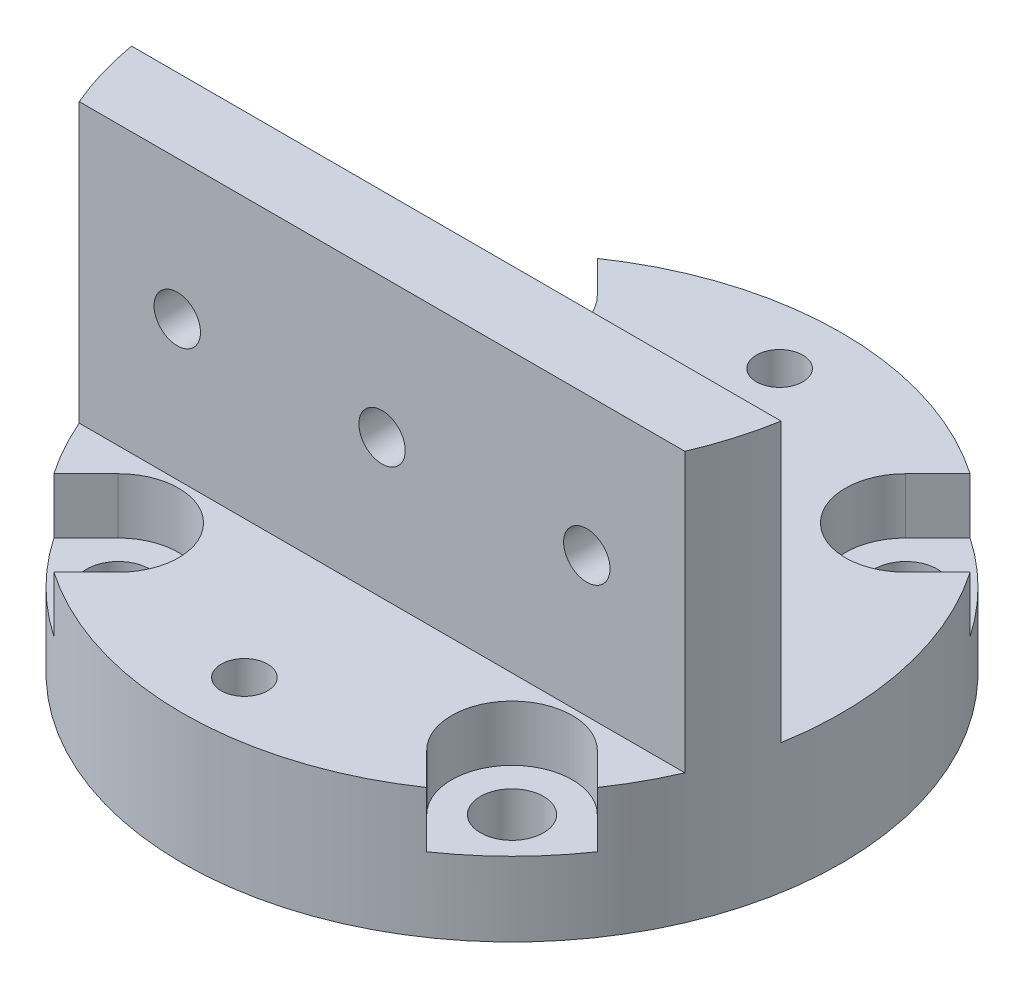
ISO-10303-21;
HEADER;
FILE_DESCRIPTION(('STEP AP214'),'2;1');
FILE_NAME('part.step','',(''),(''),'','','');
FILE_SCHEMA(('AUTOMOTIVE_DESIGN { 1 0 10303 214 1 1 1 1 }'));
ENDSEC;
DATA;
#1=APPLICATION_CONTEXT('core data for automotive mechanical design processes');
#2=APPLICATION_PROTOCOL_DEFINITION('international standard','automotive_design',2000,#1);
#3=PRODUCT_CONTEXT('',#1,'mechanical');
#4=PRODUCT('Part','Part','',(#3));
#5=PRODUCT_RELATED_PRODUCT_CATEGORY('part','',(#4));
#6=PRODUCT_DEFINITION_FORMATION('','',#4);
#7=PRODUCT_DEFINITION_CONTEXT('part definition',#1,'design');
#8=PRODUCT_DEFINITION('design','',#6,#7);
#9=PRODUCT_DEFINITION_SHAPE('','',#8);
#10=(LENGTH_UNIT() NAMED_UNIT(*) SI_UNIT(.MILLI.,.METRE.));
#11=(NAMED_UNIT(*) PLANE_ANGLE_UNIT() SI_UNIT($,.RADIAN.));
#12=(NAMED_UNIT(*) SI_UNIT($,.STERADIAN.) SOLID_ANGLE_UNIT());
#13=UNCERTAINTY_MEASURE_WITH_UNIT(LENGTH_MEASURE(1.E-05),#10,'distance_accuracy_value','');
#14=(GEOMETRIC_REPRESENTATION_CONTEXT(3) GLOBAL_UNCERTAINTY_ASSIGNED_CONTEXT((#13)) GLOBAL_UNIT_ASSIGNED_CONTEXT((#10,
#11,#12)) REPRESENTATION_CONTEXT('',''));
#15=CARTESIAN_POINT('',(0.,0.,0.));
#16=DIRECTION('',(0.,0.,1.));
#17=DIRECTION('',(1.,0.,0.));
#18=AXIS2_PLACEMENT_3D('',#15,#16,#17);
#19=CARTESIAN_POINT('',(-17.75,6.999988,7.00000003700001));
#20=DIRECTION('',(0.,-1.,0.));
#21=DIRECTION('',(0.,0.,-1.));
#22=AXIS2_PLACEMENT_3D('',#19,#20,#21);
#23=PLANE('',#22);
#24=CARTESIAN_POINT('',(0.,6.999988,0.));
#25=DIRECTION('',(0.,-1.,0.));
#26=DIRECTION('',(0.,0.,-1.));
#27=AXIS2_PLACEMENT_3D('',#24,#25,#26);
#28=CIRCLE('',#27,17.75);
#29=CARTESIAN_POINT('',(-14.6370326544302,6.999988,10.0409050923218));
#30=VERTEX_POINT('',#29);
#31=CARTESIAN_POINT('',(-16.3114223623202,6.999988,7.00000003700001));
#32=VERTEX_POINT('',#31);
#33=EDGE_CURVE('E489',#30,#32,#28,.T.);
#34=ORIENTED_EDGE('',*,*,#33,.F.);
#35=DIRECTION('',(-0.707106781119872,0.,0.707106781253224));
#36=VECTOR('',#35,1.);
#37=CARTESIAN_POINT('',(-12.9154271192876,6.999988,8.31929955685467));
#38=LINE('',#37,#36);
#39=CARTESIAN_POINT('',(-12.9154271192876,6.999988,8.31929955685467));
#40=VERTEX_POINT('',#39);
#41=EDGE_CURVE('E229',#40,#30,#38,.T.);
#42=ORIENTED_EDGE('',*,*,#41,.F.);
#43=CARTESIAN_POINT('',(-10.605000001,6.999988,10.605000001));
#44=DIRECTION('',(0.,1.,0.));
#45=DIRECTION('',(0.,0.,1.));
#46=AXIS2_PLACEMENT_3D('',#43,#44,#45);
#47=CIRCLE('',#46,3.25);
#48=CARTESIAN_POINT('',(-8.306902960926,6.999988,12.9030970386386));
#49=VERTEX_POINT('',#48);
#50=EDGE_CURVE('E422',#49,#40,#47,.T.);
#51=ORIENTED_EDGE('',*,*,#50,.F.);
#52=DIRECTION('',(0.707106781119871,0.,-0.707106781253225));
#53=VECTOR('',#52,1.);
#54=CARTESIAN_POINT('',(-8.30690296009053,6.999988,12.9030970394695));
#55=LINE('',#54,#53);
#56=CARTESIAN_POINT('',(-10.0408656392105,6.999988,14.6370597189166));
#57=VERTEX_POINT('',#56);
#58=EDGE_CURVE('E35',#57,#49,#55,.T.);
#59=ORIENTED_EDGE('',*,*,#58,.F.);
#60=CARTESIAN_POINT('',(10.0409050923218,6.999988,14.6370326544236));
#61=VERTEX_POINT('',#60);
#62=EDGE_CURVE('E492',#61,#57,#28,.T.);
#63=ORIENTED_EDGE('',*,*,#62,.F.);
#64=DIRECTION('',(0.707106781253224,0.,0.707106781119872));
#65=VECTOR('',#64,1.);
#66=CARTESIAN_POINT('',(8.31929955685465,6.999988,12.9154271192811));
#67=LINE('',#66,#65);
#68=CARTESIAN_POINT('',(8.31929955685465,6.999988,12.9154271192811));
#69=VERTEX_POINT('',#68);
#70=EDGE_CURVE('E210',#69,#61,#67,.T.);
#71=ORIENTED_EDGE('',*,*,#70,.F.);
#72=CARTESIAN_POINT('',(10.604999999,6.999988,10.605000001));
#73=DIRECTION('',(0.,1.,0.));
#74=DIRECTION('',(0.,0.,1.));
#75=AXIS2_PLACEMENT_3D('',#72,#73,#74);
#76=CIRCLE('',#75,3.25);
#77=CARTESIAN_POINT('',(12.903097037638,6.999988,8.30690296192543));
#78=VERTEX_POINT('',#77);
#79=EDGE_CURVE('E409',#78,#69,#76,.T.);
#80=ORIENTED_EDGE('',*,*,#79,.F.);
#81=DIRECTION('',(-0.707106781253225,0.,-0.707106781119871));
#82=VECTOR('',#81,1.);
#83=CARTESIAN_POINT('',(12.9030970394695,6.999988,8.30690296008401));
#84=LINE('',#83,#82);
#85=CARTESIAN_POINT('',(14.6370597189166,6.999988,10.040865639204));
#86=VERTEX_POINT('',#85);
#87=EDGE_CURVE('E207',#86,#78,#84,.T.);
#88=ORIENTED_EDGE('',*,*,#87,.F.);
#89=CARTESIAN_POINT('',(16.3114223623202,6.999988,7.00000003700001));
#90=VERTEX_POINT('',#89);
#91=EDGE_CURVE('E426',#90,#86,#28,.T.);
#92=ORIENTED_EDGE('',*,*,#91,.F.);
#93=DIRECTION('',(1.,0.,0.));
#94=VECTOR('',#93,1.);
#95=CARTESIAN_POINT('',(-17.75,6.999988,7.00000003700001));
#96=LINE('',#95,#94);
#97=EDGE_CURVE('E457',#32,#90,#96,.T.);
#98=ORIENTED_EDGE('',*,*,#97,.F.);
#99=EDGE_LOOP('',(#34,#42,#51,#59,#63,#71,#80,#88,#92,#98));
#100=FACE_BOUND('',#99,.T.);
#101=CARTESIAN_POINT('',(0.,6.999988,14.415000001));
#102=DIRECTION('',(0.,1.,0.));
#103=DIRECTION('',(0.,0.,1.));
#104=AXIS2_PLACEMENT_3D('',#101,#102,#103);
#105=CIRCLE('',#104,1.25);
#106=CARTESIAN_POINT('',(0.,6.999988,15.665000001));
#107=VERTEX_POINT('',#106);
#108=EDGE_CURVE('E268',#107,#107,#105,.T.);
#109=ORIENTED_EDGE('',*,*,#108,.F.);
#110=EDGE_LOOP('',(#109));
#111=FACE_BOUND('',#110,.T.);
#112=ADVANCED_FACE('F17',(#100,#111),#23,.F.);
#113=CARTESIAN_POINT('',(0.,21.99999991,0.));
#114=DIRECTION('',(0.,1.,0.));
#115=DIRECTION('',(0.,0.,1.));
#116=AXIS2_PLACEMENT_3D('',#113,#114,#115);
#117=PLANE('',#116);
#118=CARTESIAN_POINT('',(0.,21.99999991,0.));
#119=DIRECTION('',(0.,1.,0.));
#120=DIRECTION('',(0.,0.,1.));
#121=AXIS2_PLACEMENT_3D('',#118,#119,#120);
#122=CIRCLE('',#121,17.75);
#123=CARTESIAN_POINT('',(16.3114223623202,21.99999991,7.00000003700001));
#124=VERTEX_POINT('',#123);
#125=CARTESIAN_POINT('',(17.4946420307476,21.99999991,3.00000003600001));
#126=VERTEX_POINT('',#125);
#127=EDGE_CURVE('E476',#124,#126,#122,.T.);
#128=ORIENTED_EDGE('',*,*,#127,.T.);
#129=DIRECTION('',(-1.,0.,0.));
#130=VECTOR('',#129,1.);
#131=CARTESIAN_POINT('',(0.,21.99999991,3.00000003600001));
#132=LINE('',#131,#130);
#133=CARTESIAN_POINT('',(-17.4946420307476,21.99999991,3.00000003600001));
#134=VERTEX_POINT('',#133);
#135=EDGE_CURVE('E454',#126,#134,#132,.T.);
#136=ORIENTED_EDGE('',*,*,#135,.T.);
#137=CARTESIAN_POINT('',(-16.3114223623202,21.99999991,7.00000003700001));
#138=VERTEX_POINT('',#137);
#139=EDGE_CURVE('E480',#134,#138,#122,.T.);
#140=ORIENTED_EDGE('',*,*,#139,.T.);
#141=DIRECTION('',(-1.,0.,0.));
#142=VECTOR('',#141,1.);
#143=CARTESIAN_POINT('',(0.,21.99999991,7.00000003700001));
#144=LINE('',#143,#142);
#145=EDGE_CURVE('E479',#124,#138,#144,.T.);
#146=ORIENTED_EDGE('',*,*,#145,.F.);
#147=EDGE_LOOP('',(#128,#136,#140,#146));
#148=FACE_BOUND('',#147,.T.);
#149=ADVANCED_FACE('F520',(#148),#117,.T.);
#150=CARTESIAN_POINT('',(0.,21.99999991,0.));
#151=DIRECTION('',(0.,-1.,0.));
#152=DIRECTION('',(0.,0.,-1.));
#153=AXIS2_PLACEMENT_3D('',#150,#151,#152);
#154=CYLINDRICAL_SURFACE('',#153,17.75);
#155=CARTESIAN_POINT('',(0.,3.999988,0.));
#156=DIRECTION('',(0.,-1.,0.));
#157=DIRECTION('',(0.,0.,-1.));
#158=AXIS2_PLACEMENT_3D('',#155,#156,#157);
#159=CIRCLE('',#158,17.75);
#160=CARTESIAN_POINT('',(-10.0408656392105,3.999988,14.6370597189166));
#161=VERTEX_POINT('',#160);
#162=CARTESIAN_POINT('',(-14.6370326544302,3.999988,10.0409050923218));
#163=VERTEX_POINT('',#162);
#164=EDGE_CURVE('E425',#161,#163,#159,.T.);
#165=ORIENTED_EDGE('',*,*,#164,.T.);
#166=DIRECTION('',(0.,1.,0.));
#167=VECTOR('',#166,1.);
#168=CARTESIAN_POINT('',(-14.6370326544302,-4.94342496220292,10.0409050923218));
#169=LINE('',#168,#167);
#170=EDGE_CURVE('E232',#163,#30,#169,.T.);
#171=ORIENTED_EDGE('',*,*,#170,.T.);
#172=ORIENTED_EDGE('',*,*,#33,.T.);
#173=DIRECTION('',(0.,-1.,0.));
#174=VECTOR('',#173,1.);
#175=CARTESIAN_POINT('',(-16.3114223623202,21.99999991,7.00000003700001));
#176=LINE('',#175,#174);
#177=EDGE_CURVE('E469',#32,#138,#176,.F.);
#178=ORIENTED_EDGE('',*,*,#177,.T.);
#179=ORIENTED_EDGE('',*,*,#139,.F.);
#180=DIRECTION('',(0.,1.,0.));
#181=VECTOR('',#180,1.);
#182=CARTESIAN_POINT('',(-17.4946420307476,-29.0034840547894,3.00000003600001));
#183=LINE('',#182,#181);
#184=CARTESIAN_POINT('',(-17.4946420307476,6.999988,3.00000003600001));
#185=VERTEX_POINT('',#184);
#186=EDGE_CURVE('E461',#185,#134,#183,.T.);
#187=ORIENTED_EDGE('',*,*,#186,.F.);
#188=CARTESIAN_POINT('',(0.,6.999988,0.));
#189=DIRECTION('',(0.,-1.,0.));
#190=DIRECTION('',(0.,0.,-1.));
#191=AXIS2_PLACEMENT_3D('',#188,#189,#190);
#192=CIRCLE('',#191,17.75);
#193=CARTESIAN_POINT('',(-14.6370597189231,6.999988,-10.0408656392105));
#194=VERTEX_POINT('',#193);
#195=EDGE_CURVE('E486',#185,#194,#192,.T.);
#196=ORIENTED_EDGE('',*,*,#195,.T.);
#197=DIRECTION('',(0.,1.,0.));
#198=VECTOR('',#197,1.);
#199=CARTESIAN_POINT('',(-14.6370597189231,-4.94342496220291,-10.0408656392105));
#200=LINE('',#199,#198);
#201=CARTESIAN_POINT('',(-14.6370597189231,3.999988,-10.0408656392105));
#202=VERTEX_POINT('',#201);
#203=EDGE_CURVE('E254',#202,#194,#200,.T.);
#204=ORIENTED_EDGE('',*,*,#203,.F.);
#205=CARTESIAN_POINT('',(0.,3.999988,0.));
#206=DIRECTION('',(0.,-1.,0.));
#207=DIRECTION('',(0.,0.,-1.));
#208=AXIS2_PLACEMENT_3D('',#205,#206,#207);
#209=CIRCLE('',#208,17.75);
#210=CARTESIAN_POINT('',(-10.0409050923284,3.999988,-14.6370326544301));
#211=VERTEX_POINT('',#210);
#212=EDGE_CURVE('E11',#202,#211,#209,.T.);
#213=ORIENTED_EDGE('',*,*,#212,.T.);
#214=DIRECTION('',(0.,1.,0.));
#215=VECTOR('',#214,1.);
#216=CARTESIAN_POINT('',(-10.0409050923284,-4.94342496220291,-14.6370326544301));
#217=LINE('',#216,#215);
#218=CARTESIAN_POINT('',(-10.0409050923284,6.999988,-14.6370326544301));
#219=VERTEX_POINT('',#218);
#220=EDGE_CURVE('E249',#211,#219,#217,.T.);
#221=ORIENTED_EDGE('',*,*,#220,.T.);
#222=CARTESIAN_POINT('',(10.040865639204,6.999988,-14.6370597189231));
#223=VERTEX_POINT('',#222);
#224=EDGE_CURVE('E485',#219,#223,#192,.T.);
#225=ORIENTED_EDGE('',*,*,#224,.T.);
#226=DIRECTION('',(0.,1.,0.));
#227=VECTOR('',#226,1.);
#228=CARTESIAN_POINT('',(10.040865639204,-4.94342496220291,-14.6370597189231));
#229=LINE('',#228,#227);
#230=CARTESIAN_POINT('',(10.040865639204,3.999988,-14.6370597189231));
#231=VERTEX_POINT('',#230);
#232=EDGE_CURVE('E175',#231,#223,#229,.T.);
#233=ORIENTED_EDGE('',*,*,#232,.F.);
#234=CARTESIAN_POINT('',(0.,3.999988,0.));
#235=DIRECTION('',(0.,-1.,0.));
#236=DIRECTION('',(0.,0.,-1.));
#237=AXIS2_PLACEMENT_3D('',#234,#235,#236);
#238=CIRCLE('',#237,17.75);
#239=CARTESIAN_POINT('',(14.6370326544236,3.999988,-10.0409050923284));
#240=VERTEX_POINT('',#239);
#241=EDGE_CURVE('E27',#231,#240,#238,.T.);
#242=ORIENTED_EDGE('',*,*,#241,.T.);
#243=DIRECTION('',(0.,1.,0.));
#244=VECTOR('',#243,1.);
#245=CARTESIAN_POINT('',(14.6370326544236,-4.94342496220291,-10.0409050923284));
#246=LINE('',#245,#244);
#247=CARTESIAN_POINT('',(14.6370326544236,6.999988,-10.0409050923284));
#248=VERTEX_POINT('',#247);
#249=EDGE_CURVE('E172',#240,#248,#246,.T.);
#250=ORIENTED_EDGE('',*,*,#249,.T.);
#251=CARTESIAN_POINT('',(0.,6.999988,0.));
#252=DIRECTION('',(0.,-1.,0.));
#253=DIRECTION('',(0.,0.,-1.));
#254=AXIS2_PLACEMENT_3D('',#251,#252,#253);
#255=CIRCLE('',#254,17.75);
#256=CARTESIAN_POINT('',(17.4946420307476,6.999988,3.00000003600001));
#257=VERTEX_POINT('',#256);
#258=EDGE_CURVE('E459',#257,#248,#255,.F.);
#259=ORIENTED_EDGE('',*,*,#258,.F.);
#260=DIRECTION('',(0.,1.,0.));
#261=VECTOR('',#260,1.);
#262=CARTESIAN_POINT('',(17.4946420307476,-29.0034840547894,3.00000003600001));
#263=LINE('',#262,#261);
#264=EDGE_CURVE('E458',#257,#126,#263,.T.);
#265=ORIENTED_EDGE('',*,*,#264,.T.);
#266=ORIENTED_EDGE('',*,*,#127,.F.);
#267=DIRECTION('',(0.,-1.,0.));
#268=VECTOR('',#267,1.);
#269=CARTESIAN_POINT('',(16.3114223623202,21.99999991,7.00000003700001));
#270=LINE('',#269,#268);
#271=EDGE_CURVE('E472',#124,#90,#270,.T.);
#272=ORIENTED_EDGE('',*,*,#271,.T.);
#273=ORIENTED_EDGE('',*,*,#91,.T.);
#274=DIRECTION('',(0.,1.,0.));
#275=VECTOR('',#274,1.);
#276=CARTESIAN_POINT('',(14.6370597189166,-4.94342496220292,10.040865639204));
#277=LINE('',#276,#275);
#278=CARTESIAN_POINT('',(14.6370597189166,3.999988,10.040865639204));
#279=VERTEX_POINT('',#278);
#280=EDGE_CURVE('E220',#279,#86,#277,.T.);
#281=ORIENTED_EDGE('',*,*,#280,.F.);
#282=CARTESIAN_POINT('',(0.,3.999988,0.));
#283=DIRECTION('',(0.,-1.,0.));
#284=DIRECTION('',(0.,0.,-1.));
#285=AXIS2_PLACEMENT_3D('',#282,#283,#284);
#286=CIRCLE('',#285,17.75);
#287=CARTESIAN_POINT('',(10.0409050923218,3.999988,14.6370326544236));
#288=VERTEX_POINT('',#287);
#289=EDGE_CURVE('E180',#279,#288,#286,.T.);
#290=ORIENTED_EDGE('',*,*,#289,.T.);
#291=DIRECTION('',(0.,1.,0.));
#292=VECTOR('',#291,1.);
#293=CARTESIAN_POINT('',(10.0409050923218,-4.94342496220292,14.6370326544236));
#294=LINE('',#293,#292);
#295=EDGE_CURVE('E215',#288,#61,#294,.T.);
#296=ORIENTED_EDGE('',*,*,#295,.T.);
#297=ORIENTED_EDGE('',*,*,#62,.T.);
#298=DIRECTION('',(0.,1.,0.));
#299=VECTOR('',#298,1.);
#300=CARTESIAN_POINT('',(-10.0408656392105,-4.94342496220292,14.6370597189166));
#301=LINE('',#300,#299);
#302=EDGE_CURVE('E237',#161,#57,#301,.T.);
#303=ORIENTED_EDGE('',*,*,#302,.F.);
#304=EDGE_LOOP('',(#165,#171,#172,#178,#179,#187,#196,#204,#213,#221,#225,#233,#242,#250,#259,
#265,#266,#272,#273,#281,#290,#296,#297,#303));
#305=FACE_BOUND('',#304,.T.);
#306=CARTESIAN_POINT('',(0.,0.,0.));
#307=DIRECTION('',(0.,1.,0.));
#308=DIRECTION('',(0.,0.,1.));
#309=AXIS2_PLACEMENT_3D('',#306,#307,#308);
#310=CIRCLE('',#309,17.75);
#311=CARTESIAN_POINT('',(0.,0.,17.75));
#312=VERTEX_POINT('',#311);
#313=EDGE_CURVE('E475',#312,#312,#310,.T.);
#314=ORIENTED_EDGE('',*,*,#313,.T.);
#315=EDGE_LOOP('',(#314));
#316=FACE_BOUND('',#315,.T.);
#317=ADVANCED_FACE('F19',(#305,#316),#154,.T.);
#318=CARTESIAN_POINT('',(0.,0.,0.));
#319=DIRECTION('',(0.,1.,0.));
#320=DIRECTION('',(0.,0.,1.));
#321=AXIS2_PLACEMENT_3D('',#318,#319,#320);
#322=PLANE('',#321);
#323=CARTESIAN_POINT('',(0.,0.,-14.414999999));
#324=DIRECTION('',(0.,1.,0.));
#325=DIRECTION('',(0.,0.,1.));
#326=AXIS2_PLACEMENT_3D('',#323,#324,#325);
#327=CIRCLE('',#326,1.25);
#328=CARTESIAN_POINT('',(0.,0.,-13.164999999));
#329=VERTEX_POINT('',#328);
#330=EDGE_CURVE('E265',#329,#329,#327,.T.);
#331=ORIENTED_EDGE('',*,*,#330,.T.);
#332=EDGE_LOOP('',(#331));
#333=FACE_BOUND('',#332,.T.);
#334=CARTESIAN_POINT('',(0.,0.,14.415000001));
#335=DIRECTION('',(0.,1.,0.));
#336=DIRECTION('',(0.,0.,1.));
#337=AXIS2_PLACEMENT_3D('',#334,#335,#336);
#338=CIRCLE('',#337,1.25);
#339=CARTESIAN_POINT('',(0.,0.,15.665000001));
#340=VERTEX_POINT('',#339);
#341=EDGE_CURVE('E271',#340,#340,#338,.T.);
#342=ORIENTED_EDGE('',*,*,#341,.T.);
#343=EDGE_LOOP('',(#342));
#344=FACE_BOUND('',#343,.T.);
#345=CARTESIAN_POINT('',(-10.605000001,0.,-10.604999999));
#346=DIRECTION('',(0.,1.,0.));
#347=DIRECTION('',(0.,0.,1.));
#348=AXIS2_PLACEMENT_3D('',#345,#346,#347);
#349=CIRCLE('',#348,1.7);
#350=CARTESIAN_POINT('',(-10.605000001,0.,-8.904999999));
#351=VERTEX_POINT('',#350);
#352=EDGE_CURVE('E394',#351,#351,#349,.T.);
#353=ORIENTED_EDGE('',*,*,#352,.T.);
#354=EDGE_LOOP('',(#353));
#355=FACE_BOUND('',#354,.T.);
#356=CARTESIAN_POINT('',(10.604999999,0.,-10.604999999));
#357=DIRECTION('',(0.,1.,0.));
#358=DIRECTION('',(0.,0.,1.));
#359=AXIS2_PLACEMENT_3D('',#356,#357,#358);
#360=CIRCLE('',#359,1.7);
#361=CARTESIAN_POINT('',(10.604999999,0.,-8.904999999));
#362=VERTEX_POINT('',#361);
#363=EDGE_CURVE('E406',#362,#362,#360,.T.);
#364=ORIENTED_EDGE('',*,*,#363,.T.);
#365=EDGE_LOOP('',(#364));
#366=FACE_BOUND('',#365,.T.);
#367=CARTESIAN_POINT('',(10.604999999,0.,10.605000001));
#368=DIRECTION('',(0.,1.,0.));
#369=DIRECTION('',(0.,0.,1.));
#370=AXIS2_PLACEMENT_3D('',#367,#368,#369);
#371=CIRCLE('',#370,1.7);
#372=CARTESIAN_POINT('',(10.604999999,0.,12.305000001));
#373=VERTEX_POINT('',#372);
#374=EDGE_CURVE('E418',#373,#373,#371,.T.);
#375=ORIENTED_EDGE('',*,*,#374,.T.);
#376=EDGE_LOOP('',(#375));
#377=FACE_BOUND('',#376,.T.);
#378=CARTESIAN_POINT('',(-10.605000001,0.,10.605000001));
#379=DIRECTION('',(0.,1.,0.));
#380=DIRECTION('',(0.,0.,1.));
#381=AXIS2_PLACEMENT_3D('',#378,#379,#380);
#382=CIRCLE('',#381,1.7);
#383=CARTESIAN_POINT('',(-10.605000001,0.,12.305000001));
#384=VERTEX_POINT('',#383);
#385=EDGE_CURVE('E432',#384,#384,#382,.T.);
#386=ORIENTED_EDGE('',*,*,#385,.T.);
#387=EDGE_LOOP('',(#386));
#388=FACE_BOUND('',#387,.T.);
#389=ORIENTED_EDGE('',*,*,#313,.F.);
#390=EDGE_LOOP('',(#389));
#391=FACE_BOUND('',#390,.T.);
#392=ADVANCED_FACE('F553',(#333,#344,#355,#366,#377,#388,#391),#322,.F.);
#393=CARTESIAN_POINT('',(-17.75,21.99999991,7.00000003700001));
#394=DIRECTION('',(0.,0.,-1.));
#395=DIRECTION('',(0.,1.,0.));
#396=AXIS2_PLACEMENT_3D('',#393,#394,#395);
#397=PLANE('',#396);
#398=CARTESIAN_POINT('',(-11.0300000130771,14.499988,7.00000003700001));
#399=DIRECTION('',(0.,0.,-1.));
#400=DIRECTION('',(0.,1.,0.));
#401=AXIS2_PLACEMENT_3D('',#398,#399,#400);
#402=CIRCLE('',#401,1.25);
#403=CARTESIAN_POINT('',(-11.0300000130771,15.749988,7.00000003700001));
#404=VERTEX_POINT('',#403);
#405=EDGE_CURVE('E438',#404,#404,#402,.T.);
#406=ORIENTED_EDGE('',*,*,#405,.T.);
#407=EDGE_LOOP('',(#406));
#408=FACE_BOUND('',#407,.T.);
#409=CARTESIAN_POINT('',(-1.30771105749661E-08,14.499988,7.00000003700001));
#410=DIRECTION('',(0.,0.,-1.));
#411=DIRECTION('',(0.,1.,0.));
#412=AXIS2_PLACEMENT_3D('',#409,#410,#411);
#413=CIRCLE('',#412,1.25);
#414=CARTESIAN_POINT('',(-1.30771105749661E-08,15.749988,7.00000003700001));
#415=VERTEX_POINT('',#414);
#416=EDGE_CURVE('E444',#415,#415,#413,.T.);
#417=ORIENTED_EDGE('',*,*,#416,.T.);
#418=EDGE_LOOP('',(#417));
#419=FACE_BOUND('',#418,.T.);
#420=CARTESIAN_POINT('',(11.0299999869229,14.499988,7.00000003700001));
#421=DIRECTION('',(0.,0.,-1.));
#422=DIRECTION('',(0.,1.,0.));
#423=AXIS2_PLACEMENT_3D('',#420,#421,#422);
#424=CIRCLE('',#423,1.25);
#425=CARTESIAN_POINT('',(11.0299999869229,15.749988,7.00000003700001));
#426=VERTEX_POINT('',#425);
#427=EDGE_CURVE('E450',#426,#426,#424,.T.);
#428=ORIENTED_EDGE('',*,*,#427,.T.);
#429=EDGE_LOOP('',(#428));
#430=FACE_BOUND('',#429,.T.);
#431=ORIENTED_EDGE('',*,*,#145,.T.);
#432=ORIENTED_EDGE('',*,*,#177,.F.);
#433=ORIENTED_EDGE('',*,*,#97,.T.);
#434=ORIENTED_EDGE('',*,*,#271,.F.);
#435=EDGE_LOOP('',(#431,#432,#433,#434));
#436=FACE_BOUND('',#435,.T.);
#437=ADVANCED_FACE('F367',(#408,#419,#430,#436),#397,.F.);
#438=CARTESIAN_POINT('',(-17.75,6.999988,-26.4446967741935));
#439=DIRECTION('',(0.,-1.,0.));
#440=DIRECTION('',(0.,0.,-1.));
#441=AXIS2_PLACEMENT_3D('',#438,#439,#440);
#442=PLANE('',#441);
#443=ORIENTED_EDGE('',*,*,#258,.T.);
#444=DIRECTION('',(0.707106781119872,0.,-0.707106781253224));
#445=VECTOR('',#444,1.);
#446=CARTESIAN_POINT('',(12.9154271192811,6.999988,-8.31929955686117));
#447=LINE('',#446,#445);
#448=CARTESIAN_POINT('',(12.9154271192811,6.999988,-8.31929955686117));
#449=VERTEX_POINT('',#448);
#450=EDGE_CURVE('E187',#449,#248,#447,.T.);
#451=ORIENTED_EDGE('',*,*,#450,.F.);
#452=CARTESIAN_POINT('',(10.604999999,6.999988,-10.604999999));
#453=DIRECTION('',(0.,1.,0.));
#454=DIRECTION('',(0.,0.,1.));
#455=AXIS2_PLACEMENT_3D('',#452,#453,#454);
#456=CIRCLE('',#455,3.25);
#457=CARTESIAN_POINT('',(10.690510215049,6.999988,-7.35612511637505));
#458=VERTEX_POINT('',#457);
#459=EDGE_CURVE('E301',#458,#449,#456,.T.);
#460=ORIENTED_EDGE('',*,*,#459,.F.);
#461=CARTESIAN_POINT('',(10.604999999,6.999988,-10.604999999));
#462=DIRECTION('',(0.,1.,0.));
#463=DIRECTION('',(-0.0263108357073746,0.,0.999653810038445));
#464=AXIS2_PLACEMENT_3D('',#461,#462,#463);
#465=CIRCLE('',#464,3.25);
#466=CARTESIAN_POINT('',(10.519489782951,6.999988,-7.35612511637505));
#467=VERTEX_POINT('',#466);
#468=EDGE_CURVE('E296',#467,#458,#465,.T.);
#469=ORIENTED_EDGE('',*,*,#468,.F.);
#470=CARTESIAN_POINT('',(8.306902960926,6.999988,-12.9030970386386));
#471=VERTEX_POINT('',#470);
#472=EDGE_CURVE('E21',#471,#467,#456,.T.);
#473=ORIENTED_EDGE('',*,*,#472,.F.);
#474=DIRECTION('',(-0.707106781119871,0.,0.707106781253224));
#475=VECTOR('',#474,1.);
#476=CARTESIAN_POINT('',(8.30690296008399,6.999988,-12.903097039476));
#477=LINE('',#476,#475);
#478=EDGE_CURVE('E193',#223,#471,#477,.T.);
#479=ORIENTED_EDGE('',*,*,#478,.F.);
#480=ORIENTED_EDGE('',*,*,#224,.F.);
#481=DIRECTION('',(-0.707106781253224,0.,-0.707106781119871));
#482=VECTOR('',#481,1.);
#483=CARTESIAN_POINT('',(-8.31929955686101,6.999988,-12.9154271192875));
#484=LINE('',#483,#482);
#485=CARTESIAN_POINT('',(-8.31929955686101,6.999988,-12.9154271192875));
#486=VERTEX_POINT('',#485);
#487=EDGE_CURVE('E206',#486,#219,#484,.T.);
#488=ORIENTED_EDGE('',*,*,#487,.F.);
#489=CARTESIAN_POINT('',(-10.605000001,6.999988,-10.604999999));
#490=DIRECTION('',(0.,1.,0.));
#491=DIRECTION('',(0.,0.,1.));
#492=AXIS2_PLACEMENT_3D('',#489,#490,#491);
#493=CIRCLE('',#492,3.25);
#494=CARTESIAN_POINT('',(-10.5194897849511,6.999988,-7.35612511637505));
#495=VERTEX_POINT('',#494);
#496=EDGE_CURVE('E274',#495,#486,#493,.T.);
#497=ORIENTED_EDGE('',*,*,#496,.F.);
#498=CARTESIAN_POINT('',(-10.605000001,6.999988,-10.604999999));
#499=DIRECTION('',(0.,1.,0.));
#500=DIRECTION('',(-0.0263108357073644,0.,0.999653810038445));
#501=AXIS2_PLACEMENT_3D('',#498,#499,#500);
#502=CIRCLE('',#501,3.25);
#503=CARTESIAN_POINT('',(-10.6905102170489,6.999988,-7.35612511637505));
#504=VERTEX_POINT('',#503);
#505=EDGE_CURVE('E286',#504,#495,#502,.T.);
#506=ORIENTED_EDGE('',*,*,#505,.F.);
#507=CARTESIAN_POINT('',(-12.9030970396391,6.999988,-8.30690295992657));
#508=VERTEX_POINT('',#507);
#509=EDGE_CURVE('E280',#508,#504,#493,.T.);
#510=ORIENTED_EDGE('',*,*,#509,.F.);
#511=DIRECTION('',(0.707106781253224,0.,0.707106781119871));
#512=VECTOR('',#511,1.);
#513=CARTESIAN_POINT('',(-12.9030970394761,6.999988,-8.30690296009052));
#514=LINE('',#513,#512);
#515=EDGE_CURVE('E243',#194,#508,#514,.T.);
#516=ORIENTED_EDGE('',*,*,#515,.F.);
#517=ORIENTED_EDGE('',*,*,#195,.F.);
#518=DIRECTION('',(-1.,0.,0.));
#519=VECTOR('',#518,1.);
#520=CARTESIAN_POINT('',(0.,6.999988,3.00000003600001));
#521=LINE('',#520,#519);
#522=EDGE_CURVE('E453',#257,#185,#521,.T.);
#523=ORIENTED_EDGE('',*,*,#522,.F.);
#524=EDGE_LOOP('',(#443,#451,#460,#469,#473,#479,#480,#488,#497,#506,#510,#516,#517,#523));
#525=FACE_BOUND('',#524,.T.);
#526=CARTESIAN_POINT('',(0.,6.999988,-14.414999999));
#527=DIRECTION('',(0.,1.,0.));
#528=DIRECTION('',(0.,0.,1.));
#529=AXIS2_PLACEMENT_3D('',#526,#527,#528);
#530=CIRCLE('',#529,1.25);
#531=CARTESIAN_POINT('',(0.,6.999988,-13.164999999));
#532=VERTEX_POINT('',#531);
#533=EDGE_CURVE('E262',#532,#532,#530,.T.);
#534=ORIENTED_EDGE('',*,*,#533,.F.);
#535=EDGE_LOOP('',(#534));
#536=FACE_BOUND('',#535,.T.);
#537=ADVANCED_FACE('F362',(#525,#536),#442,.F.);
#538=CARTESIAN_POINT('',(0.,-29.0034840547894,3.00000003600001));
#539=DIRECTION('',(0.,0.,-1.));
#540=DIRECTION('',(-1.,0.,0.));
#541=AXIS2_PLACEMENT_3D('',#538,#539,#540);
#542=PLANE('',#541);
#543=CARTESIAN_POINT('',(-11.0300000130771,14.499988,3.00000003600001));
#544=DIRECTION('',(0.,0.,-1.));
#545=DIRECTION('',(-1.,0.,0.));
#546=AXIS2_PLACEMENT_3D('',#543,#544,#545);
#547=CIRCLE('',#546,1.25);
#548=CARTESIAN_POINT('',(-12.2800000130771,14.499988,3.00000003600001));
#549=VERTEX_POINT('',#548);
#550=EDGE_CURVE('E435',#549,#549,#547,.T.);
#551=ORIENTED_EDGE('',*,*,#550,.F.);
#552=EDGE_LOOP('',(#551));
#553=FACE_BOUND('',#552,.T.);
#554=CARTESIAN_POINT('',(-1.30771105749661E-08,14.499988,3.00000003600001));
#555=DIRECTION('',(0.,0.,-1.));
#556=DIRECTION('',(-1.,0.,0.));
#557=AXIS2_PLACEMENT_3D('',#554,#555,#556);
#558=CIRCLE('',#557,1.25);
#559=CARTESIAN_POINT('',(-1.25000001307711,14.499988,3.00000003600001));
#560=VERTEX_POINT('',#559);
#561=EDGE_CURVE('E441',#560,#560,#558,.T.);
#562=ORIENTED_EDGE('',*,*,#561,.F.);
#563=EDGE_LOOP('',(#562));
#564=FACE_BOUND('',#563,.T.);
#565=CARTESIAN_POINT('',(11.0299999869229,14.499988,3.00000003600001));
#566=DIRECTION('',(0.,0.,-1.));
#567=DIRECTION('',(-1.,0.,0.));
#568=AXIS2_PLACEMENT_3D('',#565,#566,#567);
#569=CIRCLE('',#568,1.25);
#570=CARTESIAN_POINT('',(9.7799999869229,14.499988,3.00000003600001));
#571=VERTEX_POINT('',#570);
#572=EDGE_CURVE('E447',#571,#571,#569,.T.);
#573=ORIENTED_EDGE('',*,*,#572,.F.);
#574=EDGE_LOOP('',(#573));
#575=FACE_BOUND('',#574,.T.);
#576=ORIENTED_EDGE('',*,*,#522,.T.);
#577=ORIENTED_EDGE('',*,*,#186,.T.);
#578=ORIENTED_EDGE('',*,*,#135,.F.);
#579=ORIENTED_EDGE('',*,*,#264,.F.);
#580=EDGE_LOOP('',(#576,#577,#578,#579));
#581=FACE_BOUND('',#580,.T.);
#582=ADVANCED_FACE('F358',(#553,#564,#575,#581),#542,.T.);
#583=CARTESIAN_POINT('',(11.0299999869229,14.499988,3.00000003600001));
#584=DIRECTION('',(0.,0.,-1.));
#585=DIRECTION('',(-1.,0.,0.));
#586=AXIS2_PLACEMENT_3D('',#583,#584,#585);
#587=CYLINDRICAL_SURFACE('',#586,1.25);
#588=ORIENTED_EDGE('',*,*,#427,.F.);
#589=EDGE_LOOP('',(#588));
#590=FACE_BOUND('',#589,.T.);
#591=ORIENTED_EDGE('',*,*,#572,.T.);
#592=EDGE_LOOP('',(#591));
#593=FACE_BOUND('',#592,.T.);
#594=ADVANCED_FACE('F354',(#590,#593),#587,.F.);
#595=CARTESIAN_POINT('',(-1.30771105749661E-08,14.499988,3.00000003600001));
#596=DIRECTION('',(0.,0.,-1.));
#597=DIRECTION('',(-1.,0.,0.));
#598=AXIS2_PLACEMENT_3D('',#595,#596,#597);
#599=CYLINDRICAL_SURFACE('',#598,1.25);
#600=ORIENTED_EDGE('',*,*,#416,.F.);
#601=EDGE_LOOP('',(#600));
#602=FACE_BOUND('',#601,.T.);
#603=ORIENTED_EDGE('',*,*,#561,.T.);
#604=EDGE_LOOP('',(#603));
#605=FACE_BOUND('',#604,.T.);
#606=ADVANCED_FACE('F350',(#602,#605),#599,.F.);
#607=CARTESIAN_POINT('',(-11.0300000130771,14.499988,3.00000003600001));
#608=DIRECTION('',(0.,0.,-1.));
#609=DIRECTION('',(-1.,0.,0.));
#610=AXIS2_PLACEMENT_3D('',#607,#608,#609);
#611=CYLINDRICAL_SURFACE('',#610,1.25);
#612=ORIENTED_EDGE('',*,*,#405,.F.);
#613=EDGE_LOOP('',(#612));
#614=FACE_BOUND('',#613,.T.);
#615=ORIENTED_EDGE('',*,*,#550,.T.);
#616=EDGE_LOOP('',(#615));
#617=FACE_BOUND('',#616,.T.);
#618=ADVANCED_FACE('F343',(#614,#617),#611,.F.);
#619=CARTESIAN_POINT('',(-8.905000001,3.999988,10.605000001));
#620=DIRECTION('',(0.,-1.,0.));
#621=DIRECTION('',(0.,0.,-1.));
#622=AXIS2_PLACEMENT_3D('',#619,#620,#621);
#623=PLANE('',#622);
#624=CARTESIAN_POINT('',(-10.605000001,3.999988,10.605000001));
#625=DIRECTION('',(0.,1.,0.));
#626=DIRECTION('',(0.,0.,1.));
#627=AXIS2_PLACEMENT_3D('',#624,#625,#626);
#628=CIRCLE('',#627,1.7);
#629=CARTESIAN_POINT('',(-10.605000001,3.999988,12.305000001));
#630=VERTEX_POINT('',#629);
#631=EDGE_CURVE('E429',#630,#630,#628,.T.);
#632=ORIENTED_EDGE('',*,*,#631,.F.);
#633=EDGE_LOOP('',(#632));
#634=FACE_BOUND('',#633,.T.);
#635=CARTESIAN_POINT('',(-10.605000001,3.999988,10.605000001));
#636=DIRECTION('',(0.,1.,0.));
#637=DIRECTION('',(0.,0.,1.));
#638=AXIS2_PLACEMENT_3D('',#635,#636,#637);
#639=CIRCLE('',#638,3.25);
#640=CARTESIAN_POINT('',(-8.30690296009053,3.999988,12.9030970394695));
#641=VERTEX_POINT('',#640);
#642=CARTESIAN_POINT('',(-12.9154271204564,3.999988,8.31929955569218));
#643=VERTEX_POINT('',#642);
#644=EDGE_CURVE('E421',#641,#643,#639,.T.);
#645=ORIENTED_EDGE('',*,*,#644,.T.);
#646=DIRECTION('',(-0.707106781119872,0.,0.707106781253224));
#647=VECTOR('',#646,1.);
#648=CARTESIAN_POINT('',(-12.9154271192876,3.999988,8.31929955685467));
#649=LINE('',#648,#647);
#650=EDGE_CURVE('E43',#643,#163,#649,.T.);
#651=ORIENTED_EDGE('',*,*,#650,.T.);
#652=ORIENTED_EDGE('',*,*,#164,.F.);
#653=DIRECTION('',(0.707106781119871,0.,-0.707106781253224));
#654=VECTOR('',#653,1.);
#655=CARTESIAN_POINT('',(-8.30690296009053,3.999988,12.9030970394695));
#656=LINE('',#655,#654);
#657=EDGE_CURVE('E233',#161,#641,#656,.T.);
#658=ORIENTED_EDGE('',*,*,#657,.T.);
#659=EDGE_LOOP('',(#645,#651,#652,#658));
#660=FACE_BOUND('',#659,.T.);
#661=ADVANCED_FACE('F339',(#634,#660),#623,.F.);
#662=CARTESIAN_POINT('',(-10.605000001,6.999988,10.605000001));
#663=DIRECTION('',(0.,1.,0.));
#664=DIRECTION('',(0.,0.,1.));
#665=AXIS2_PLACEMENT_3D('',#662,#663,#664);
#666=CYLINDRICAL_SURFACE('',#665,3.25);
#667=ORIENTED_EDGE('',*,*,#50,.T.);
#668=DIRECTION('',(0.,1.,0.));
#669=VECTOR('',#668,1.);
#670=CARTESIAN_POINT('',(-12.9154271192876,-4.94342496220292,8.31929955685466));
#671=LINE('',#670,#669);
#672=EDGE_CURVE('E212',#643,#40,#671,.T.);
#673=ORIENTED_EDGE('',*,*,#672,.F.);
#674=ORIENTED_EDGE('',*,*,#644,.F.);
#675=DIRECTION('',(0.,1.,0.));
#676=VECTOR('',#675,1.);
#677=CARTESIAN_POINT('',(-8.30690296009053,-4.94342496220292,12.9030970394695));
#678=LINE('',#677,#676);
#679=EDGE_CURVE('E236',#641,#49,#678,.T.);
#680=ORIENTED_EDGE('',*,*,#679,.T.);
#681=EDGE_LOOP('',(#667,#673,#674,#680));
#682=FACE_BOUND('',#681,.T.);
#683=ADVANCED_FACE('F336',(#682),#666,.F.);
#684=CARTESIAN_POINT('',(-10.605000001,6.999988,10.605000001));
#685=DIRECTION('',(0.,1.,0.));
#686=DIRECTION('',(0.,0.,1.));
#687=AXIS2_PLACEMENT_3D('',#684,#685,#686);
#688=CYLINDRICAL_SURFACE('',#687,1.7);
#689=ORIENTED_EDGE('',*,*,#385,.F.);
#690=EDGE_LOOP('',(#689));
#691=FACE_BOUND('',#690,.T.);
#692=ORIENTED_EDGE('',*,*,#631,.T.);
#693=EDGE_LOOP('',(#692));
#694=FACE_BOUND('',#693,.T.);
#695=ADVANCED_FACE('F331',(#691,#694),#688,.F.);
#696=CARTESIAN_POINT('',(12.304999999,3.999988,10.605000001));
#697=DIRECTION('',(0.,-1.,0.));
#698=DIRECTION('',(0.,0.,-1.));
#699=AXIS2_PLACEMENT_3D('',#696,#697,#698);
#700=PLANE('',#699);
#701=CARTESIAN_POINT('',(10.604999999,3.999988,10.605000001));
#702=DIRECTION('',(0.,1.,0.));
#703=DIRECTION('',(0.,0.,1.));
#704=AXIS2_PLACEMENT_3D('',#701,#702,#703);
#705=CIRCLE('',#704,1.7);
#706=CARTESIAN_POINT('',(10.604999999,3.999988,12.305000001));
#707=VERTEX_POINT('',#706);
#708=EDGE_CURVE('E415',#707,#707,#705,.T.);
#709=ORIENTED_EDGE('',*,*,#708,.F.);
#710=EDGE_LOOP('',(#709));
#711=FACE_BOUND('',#710,.T.);
#712=CARTESIAN_POINT('',(10.604999999,3.999988,10.605000001));
#713=DIRECTION('',(0.,1.,0.));
#714=DIRECTION('',(0.,0.,1.));
#715=AXIS2_PLACEMENT_3D('',#712,#713,#714);
#716=CIRCLE('',#715,3.25);
#717=CARTESIAN_POINT('',(12.9030970394695,3.999988,8.30690296008401));
#718=VERTEX_POINT('',#717);
#719=CARTESIAN_POINT('',(8.31929955469696,3.999988,12.9154271214504));
#720=VERTEX_POINT('',#719);
#721=EDGE_CURVE('E412',#718,#720,#716,.T.);
#722=ORIENTED_EDGE('',*,*,#721,.T.);
#723=DIRECTION('',(0.707106781253224,0.,0.707106781119872));
#724=VECTOR('',#723,1.);
#725=CARTESIAN_POINT('',(8.31929955685465,3.999988,12.9154271192811));
#726=LINE('',#725,#724);
#727=EDGE_CURVE('E209',#720,#288,#726,.T.);
#728=ORIENTED_EDGE('',*,*,#727,.T.);
#729=ORIENTED_EDGE('',*,*,#289,.F.);
#730=DIRECTION('',(-0.707106781253224,0.,-0.707106781119871));
#731=VECTOR('',#730,1.);
#732=CARTESIAN_POINT('',(12.9030970394695,3.999988,8.30690296008401));
#733=LINE('',#732,#731);
#734=EDGE_CURVE('E216',#279,#718,#733,.T.);
#735=ORIENTED_EDGE('',*,*,#734,.T.);
#736=EDGE_LOOP('',(#722,#728,#729,#735));
#737=FACE_BOUND('',#736,.T.);
#738=ADVANCED_FACE('F327',(#711,#737),#700,.F.);
#739=CARTESIAN_POINT('',(10.604999999,6.999988,10.605000001));
#740=DIRECTION('',(0.,1.,0.));
#741=DIRECTION('',(0.,0.,1.));
#742=AXIS2_PLACEMENT_3D('',#739,#740,#741);
#743=CYLINDRICAL_SURFACE('',#742,3.25);
#744=ORIENTED_EDGE('',*,*,#79,.T.);
#745=DIRECTION('',(0.,1.,0.));
#746=VECTOR('',#745,1.);
#747=CARTESIAN_POINT('',(8.31929955685465,-4.94342496220292,12.9154271192811));
#748=LINE('',#747,#746);
#749=EDGE_CURVE('E223',#720,#69,#748,.T.);
#750=ORIENTED_EDGE('',*,*,#749,.F.);
#751=ORIENTED_EDGE('',*,*,#721,.F.);
#752=DIRECTION('',(0.,1.,0.));
#753=VECTOR('',#752,1.);
#754=CARTESIAN_POINT('',(12.9030970394695,-4.94342496220292,8.30690296008401));
#755=LINE('',#754,#753);
#756=EDGE_CURVE('E219',#718,#78,#755,.T.);
#757=ORIENTED_EDGE('',*,*,#756,.T.);
#758=EDGE_LOOP('',(#744,#750,#751,#757));
#759=FACE_BOUND('',#758,.T.);
#760=ADVANCED_FACE('F324',(#759),#743,.F.);
#761=CARTESIAN_POINT('',(10.604999999,6.999988,10.605000001));
#762=DIRECTION('',(0.,1.,0.));
#763=DIRECTION('',(0.,0.,1.));
#764=AXIS2_PLACEMENT_3D('',#761,#762,#763);
#765=CYLINDRICAL_SURFACE('',#764,1.7);
#766=ORIENTED_EDGE('',*,*,#374,.F.);
#767=EDGE_LOOP('',(#766));
#768=FACE_BOUND('',#767,.T.);
#769=ORIENTED_EDGE('',*,*,#708,.T.);
#770=EDGE_LOOP('',(#769));
#771=FACE_BOUND('',#770,.T.);
#772=ADVANCED_FACE('F318',(#768,#771),#765,.F.);
#773=CARTESIAN_POINT('',(12.304999999,3.999988,-10.604999999));
#774=DIRECTION('',(0.,-1.,0.));
#775=DIRECTION('',(0.,0.,-1.));
#776=AXIS2_PLACEMENT_3D('',#773,#774,#775);
#777=PLANE('',#776);
#778=CARTESIAN_POINT('',(10.604999999,3.999988,-10.604999999));
#779=DIRECTION('',(0.,1.,0.));
#780=DIRECTION('',(0.,0.,1.));
#781=AXIS2_PLACEMENT_3D('',#778,#779,#780);
#782=CIRCLE('',#781,1.7);
#783=CARTESIAN_POINT('',(10.604999999,3.999988,-8.904999999));
#784=VERTEX_POINT('',#783);
#785=EDGE_CURVE('E403',#784,#784,#782,.T.);
#786=ORIENTED_EDGE('',*,*,#785,.F.);
#787=EDGE_LOOP('',(#786));
#788=FACE_BOUND('',#787,.T.);
#789=CARTESIAN_POINT('',(10.604999999,3.999988,-10.604999999));
#790=DIRECTION('',(0.,1.,0.));
#791=DIRECTION('',(0.,0.,1.));
#792=AXIS2_PLACEMENT_3D('',#789,#790,#791);
#793=CIRCLE('',#792,3.25);
#794=CARTESIAN_POINT('',(8.30690296008399,3.999988,-12.903097039476));
#795=VERTEX_POINT('',#794);
#796=CARTESIAN_POINT('',(12.9154271204456,3.999988,-8.3192995557029));
#797=VERTEX_POINT('',#796);
#798=EDGE_CURVE('E192',#795,#797,#793,.T.);
#799=ORIENTED_EDGE('',*,*,#798,.T.);
#800=DIRECTION('',(0.707106781119872,0.,-0.707106781253224));
#801=VECTOR('',#800,1.);
#802=CARTESIAN_POINT('',(12.9154271192811,3.999988,-8.31929955686117));
#803=LINE('',#802,#801);
#804=EDGE_CURVE('E184',#797,#240,#803,.T.);
#805=ORIENTED_EDGE('',*,*,#804,.T.);
#806=ORIENTED_EDGE('',*,*,#241,.F.);
#807=DIRECTION('',(-0.707106781119871,0.,0.707106781253224));
#808=VECTOR('',#807,1.);
#809=CARTESIAN_POINT('',(8.30690296008399,3.999988,-12.903097039476));
#810=LINE('',#809,#808);
#811=EDGE_CURVE('E198',#231,#795,#810,.T.);
#812=ORIENTED_EDGE('',*,*,#811,.T.);
#813=EDGE_LOOP('',(#799,#805,#806,#812));
#814=FACE_BOUND('',#813,.T.);
#815=ADVANCED_FACE('F190',(#788,#814),#777,.F.);
#816=CARTESIAN_POINT('',(10.604999999,6.999988,-10.604999999));
#817=DIRECTION('',(0.,1.,0.));
#818=DIRECTION('',(0.,0.,1.));
#819=AXIS2_PLACEMENT_3D('',#816,#817,#818);
#820=CYLINDRICAL_SURFACE('',#819,3.25);
#821=ORIENTED_EDGE('',*,*,#459,.T.);
#822=DIRECTION('',(0.,1.,0.));
#823=VECTOR('',#822,1.);
#824=CARTESIAN_POINT('',(12.9154271192811,-4.94342496220291,-8.31929955686117));
#825=LINE('',#824,#823);
#826=EDGE_CURVE('E203',#797,#449,#825,.T.);
#827=ORIENTED_EDGE('',*,*,#826,.F.);
#828=ORIENTED_EDGE('',*,*,#798,.F.);
#829=DIRECTION('',(0.,1.,0.));
#830=VECTOR('',#829,1.);
#831=CARTESIAN_POINT('',(8.30690296008399,-4.94342496220291,-12.903097039476));
#832=LINE('',#831,#830);
#833=EDGE_CURVE('E200',#795,#471,#832,.T.);
#834=ORIENTED_EDGE('',*,*,#833,.T.);
#835=ORIENTED_EDGE('',*,*,#472,.T.);
#836=ORIENTED_EDGE('',*,*,#468,.T.);
#837=EDGE_LOOP('',(#821,#827,#828,#834,#835,#836));
#838=FACE_BOUND('',#837,.T.);
#839=ADVANCED_FACE('F303',(#838),#820,.F.);
#840=CARTESIAN_POINT('',(10.604999999,6.999988,-10.604999999));
#841=DIRECTION('',(0.,1.,0.));
#842=DIRECTION('',(0.,0.,1.));
#843=AXIS2_PLACEMENT_3D('',#840,#841,#842);
#844=CYLINDRICAL_SURFACE('',#843,1.7);
#845=ORIENTED_EDGE('',*,*,#363,.F.);
#846=EDGE_LOOP('',(#845));
#847=FACE_BOUND('',#846,.T.);
#848=ORIENTED_EDGE('',*,*,#785,.T.);
#849=EDGE_LOOP('',(#848));
#850=FACE_BOUND('',#849,.T.);
#851=ADVANCED_FACE('F313',(#847,#850),#844,.F.);
#852=CARTESIAN_POINT('',(-8.905000001,3.999988,-10.604999999));
#853=DIRECTION('',(0.,-1.,0.));
#854=DIRECTION('',(0.,0.,-1.));
#855=AXIS2_PLACEMENT_3D('',#852,#853,#854);
#856=PLANE('',#855);
#857=CARTESIAN_POINT('',(-10.605000001,3.999988,-10.604999999));
#858=DIRECTION('',(0.,1.,0.));
#859=DIRECTION('',(0.,0.,1.));
#860=AXIS2_PLACEMENT_3D('',#857,#858,#859);
#861=CIRCLE('',#860,1.7);
#862=CARTESIAN_POINT('',(-10.605000001,3.999988,-8.904999999));
#863=VERTEX_POINT('',#862);
#864=EDGE_CURVE('E390',#863,#863,#861,.T.);
#865=ORIENTED_EDGE('',*,*,#864,.F.);
#866=EDGE_LOOP('',(#865));
#867=FACE_BOUND('',#866,.T.);
#868=CARTESIAN_POINT('',(-10.605000001,3.999988,-10.604999999));
#869=DIRECTION('',(0.,1.,0.));
#870=DIRECTION('',(0.,0.,1.));
#871=AXIS2_PLACEMENT_3D('',#868,#869,#870);
#872=CIRCLE('',#871,3.25);
#873=CARTESIAN_POINT('',(-12.9030970394761,3.999988,-8.30690296009052));
#874=VERTEX_POINT('',#873);
#875=CARTESIAN_POINT('',(-8.31929955669794,3.999988,-12.9154271194514));
#876=VERTEX_POINT('',#875);
#877=EDGE_CURVE('E277',#874,#876,#872,.T.);
#878=ORIENTED_EDGE('',*,*,#877,.T.);
#879=DIRECTION('',(-0.707106781253224,0.,-0.707106781119871));
#880=VECTOR('',#879,1.);
#881=CARTESIAN_POINT('',(-8.31929955686101,3.999988,-12.9154271192875));
#882=LINE('',#881,#880);
#883=EDGE_CURVE('E245',#876,#211,#882,.T.);
#884=ORIENTED_EDGE('',*,*,#883,.T.);
#885=ORIENTED_EDGE('',*,*,#212,.F.);
#886=DIRECTION('',(0.707106781253224,0.,0.707106781119871));
#887=VECTOR('',#886,1.);
#888=CARTESIAN_POINT('',(-12.9030970394761,3.999988,-8.30690296009052));
#889=LINE('',#888,#887);
#890=EDGE_CURVE('E250',#202,#874,#889,.T.);
#891=ORIENTED_EDGE('',*,*,#890,.T.);
#892=EDGE_LOOP('',(#878,#884,#885,#891));
#893=FACE_BOUND('',#892,.T.);
#894=ADVANCED_FACE('F322',(#867,#893),#856,.F.);
#895=CARTESIAN_POINT('',(-10.605000001,6.999988,-10.604999999));
#896=DIRECTION('',(0.,1.,0.));
#897=DIRECTION('',(0.,0.,1.));
#898=AXIS2_PLACEMENT_3D('',#895,#896,#897);
#899=CYLINDRICAL_SURFACE('',#898,3.25);
#900=ORIENTED_EDGE('',*,*,#496,.T.);
#901=DIRECTION('',(0.,1.,0.));
#902=VECTOR('',#901,1.);
#903=CARTESIAN_POINT('',(-8.31929955686101,-4.94342496220291,-12.9154271192875));
#904=LINE('',#903,#902);
#905=EDGE_CURVE('E257',#876,#486,#904,.T.);
#906=ORIENTED_EDGE('',*,*,#905,.F.);
#907=ORIENTED_EDGE('',*,*,#877,.F.);
#908=DIRECTION('',(0.,1.,0.));
#909=VECTOR('',#908,1.);
#910=CARTESIAN_POINT('',(-12.9030970394761,-4.94342496220291,-8.30690296009052));
#911=LINE('',#910,#909);
#912=EDGE_CURVE('E253',#874,#508,#911,.T.);
#913=ORIENTED_EDGE('',*,*,#912,.T.);
#914=ORIENTED_EDGE('',*,*,#509,.T.);
#915=ORIENTED_EDGE('',*,*,#505,.T.);
#916=EDGE_LOOP('',(#900,#906,#907,#913,#914,#915));
#917=FACE_BOUND('',#916,.T.);
#918=ADVANCED_FACE('F528',(#917),#899,.F.);
#919=CARTESIAN_POINT('',(-10.605000001,6.999988,-10.604999999));
#920=DIRECTION('',(0.,1.,0.));
#921=DIRECTION('',(0.,0.,1.));
#922=AXIS2_PLACEMENT_3D('',#919,#920,#921);
#923=CYLINDRICAL_SURFACE('',#922,1.7);
#924=ORIENTED_EDGE('',*,*,#352,.F.);
#925=EDGE_LOOP('',(#924));
#926=FACE_BOUND('',#925,.T.);
#927=ORIENTED_EDGE('',*,*,#864,.T.);
#928=EDGE_LOOP('',(#927));
#929=FACE_BOUND('',#928,.T.);
#930=ADVANCED_FACE('F314',(#926,#929),#923,.F.);
#931=CARTESIAN_POINT('',(0.,6.999988,14.415000001));
#932=DIRECTION('',(0.,1.,0.));
#933=DIRECTION('',(0.,0.,1.));
#934=AXIS2_PLACEMENT_3D('',#931,#932,#933);
#935=CYLINDRICAL_SURFACE('',#934,1.25);
#936=ORIENTED_EDGE('',*,*,#341,.F.);
#937=EDGE_LOOP('',(#936));
#938=FACE_BOUND('',#937,.T.);
#939=ORIENTED_EDGE('',*,*,#108,.T.);
#940=EDGE_LOOP('',(#939));
#941=FACE_BOUND('',#940,.T.);
#942=ADVANCED_FACE('F598',(#938,#941),#935,.F.);
#943=CARTESIAN_POINT('',(0.,6.999988,-14.414999999));
#944=DIRECTION('',(0.,1.,0.));
#945=DIRECTION('',(0.,0.,1.));
#946=AXIS2_PLACEMENT_3D('',#943,#944,#945);
#947=CYLINDRICAL_SURFACE('',#946,1.25);
#948=ORIENTED_EDGE('',*,*,#330,.F.);
#949=EDGE_LOOP('',(#948));
#950=FACE_BOUND('',#949,.T.);
#951=ORIENTED_EDGE('',*,*,#533,.T.);
#952=EDGE_LOOP('',(#951));
#953=FACE_BOUND('',#952,.T.);
#954=ADVANCED_FACE('F592',(#950,#953),#947,.F.);
#955=CARTESIAN_POINT('',(-12.9030970394761,-4.94342496220291,-8.30690296009052));
#956=DIRECTION('',(-0.707106781119871,0.,0.707106781253224));
#957=DIRECTION('',(0.707106781253224,0.,0.707106781119871));
#958=AXIS2_PLACEMENT_3D('',#955,#956,#957);
#959=PLANE('',#958);
#960=ORIENTED_EDGE('',*,*,#203,.T.);
#961=ORIENTED_EDGE('',*,*,#515,.T.);
#962=ORIENTED_EDGE('',*,*,#912,.F.);
#963=ORIENTED_EDGE('',*,*,#890,.F.);
#964=EDGE_LOOP('',(#960,#961,#962,#963));
#965=FACE_BOUND('',#964,.T.);
#966=ADVANCED_FACE('F526',(#965),#959,.F.);
#967=CARTESIAN_POINT('',(-8.31929955686101,-4.94342496220291,-12.9154271192875));
#968=DIRECTION('',(0.707106781119871,0.,-0.707106781253224));
#969=DIRECTION('',(-0.707106781253224,0.,-0.707106781119871));
#970=AXIS2_PLACEMENT_3D('',#967,#968,#969);
#971=PLANE('',#970);
#972=ORIENTED_EDGE('',*,*,#905,.T.);
#973=ORIENTED_EDGE('',*,*,#487,.T.);
#974=ORIENTED_EDGE('',*,*,#220,.F.);
#975=ORIENTED_EDGE('',*,*,#883,.F.);
#976=EDGE_LOOP('',(#972,#973,#974,#975));
#977=FACE_BOUND('',#976,.T.);
#978=ADVANCED_FACE('F531',(#977),#971,.F.);
#979=CARTESIAN_POINT('',(8.30690296008399,-4.94342496220291,-12.903097039476));
#980=DIRECTION('',(-0.707106781253224,0.,-0.707106781119871));
#981=DIRECTION('',(-0.707106781119871,0.,0.707106781253224));
#982=AXIS2_PLACEMENT_3D('',#979,#980,#981);
#983=PLANE('',#982);
#984=ORIENTED_EDGE('',*,*,#232,.T.);
#985=ORIENTED_EDGE('',*,*,#478,.T.);
#986=ORIENTED_EDGE('',*,*,#833,.F.);
#987=ORIENTED_EDGE('',*,*,#811,.F.);
#988=EDGE_LOOP('',(#984,#985,#986,#987));
#989=FACE_BOUND('',#988,.T.);
#990=ADVANCED_FACE('F595',(#989),#983,.F.);
#991=CARTESIAN_POINT('',(12.9154271192811,-4.94342496220291,-8.31929955686117));
#992=DIRECTION('',(0.707106781253223,0.,0.707106781119872));
#993=DIRECTION('',(0.707106781119872,0.,-0.707106781253224));
#994=AXIS2_PLACEMENT_3D('',#991,#992,#993);
#995=PLANE('',#994);
#996=ORIENTED_EDGE('',*,*,#826,.T.);
#997=ORIENTED_EDGE('',*,*,#450,.T.);
#998=ORIENTED_EDGE('',*,*,#249,.F.);
#999=ORIENTED_EDGE('',*,*,#804,.F.);
#1000=EDGE_LOOP('',(#996,#997,#998,#999));
#1001=FACE_BOUND('',#1000,.T.);
#1002=ADVANCED_FACE('F183',(#1001),#995,.F.);
#1003=CARTESIAN_POINT('',(12.9030970394695,-4.94342496220292,8.30690296008401));
#1004=DIRECTION('',(0.707106781119871,0.,-0.707106781253224));
#1005=DIRECTION('',(-0.707106781253224,0.,-0.707106781119871));
#1006=AXIS2_PLACEMENT_3D('',#1003,#1004,#1005);
#1007=PLANE('',#1006);
#1008=ORIENTED_EDGE('',*,*,#280,.T.);
#1009=ORIENTED_EDGE('',*,*,#87,.T.);
#1010=ORIENTED_EDGE('',*,*,#756,.F.);
#1011=ORIENTED_EDGE('',*,*,#734,.F.);
#1012=EDGE_LOOP('',(#1008,#1009,#1010,#1011));
#1013=FACE_BOUND('',#1012,.T.);
#1014=ADVANCED_FACE('F772',(#1013),#1007,.F.);
#1015=CARTESIAN_POINT('',(8.31929955685465,-4.94342496220292,12.9154271192811));
#1016=DIRECTION('',(-0.707106781119872,0.,0.707106781253223));
#1017=DIRECTION('',(0.707106781253224,0.,0.707106781119872));
#1018=AXIS2_PLACEMENT_3D('',#1015,#1016,#1017);
#1019=PLANE('',#1018);
#1020=ORIENTED_EDGE('',*,*,#749,.T.);
#1021=ORIENTED_EDGE('',*,*,#70,.T.);
#1022=ORIENTED_EDGE('',*,*,#295,.F.);
#1023=ORIENTED_EDGE('',*,*,#727,.F.);
#1024=EDGE_LOOP('',(#1020,#1021,#1022,#1023));
#1025=FACE_BOUND('',#1024,.T.);
#1026=ADVANCED_FACE('F501',(#1025),#1019,.F.);
#1027=CARTESIAN_POINT('',(-8.30690296009053,-4.94342496220292,12.9030970394695));
#1028=DIRECTION('',(0.707106781253224,0.,0.707106781119871));
#1029=DIRECTION('',(0.707106781119871,0.,-0.707106781253224));
#1030=AXIS2_PLACEMENT_3D('',#1027,#1028,#1029);
#1031=PLANE('',#1030);
#1032=ORIENTED_EDGE('',*,*,#302,.T.);
#1033=ORIENTED_EDGE('',*,*,#58,.T.);
#1034=ORIENTED_EDGE('',*,*,#679,.F.);
#1035=ORIENTED_EDGE('',*,*,#657,.F.);
#1036=EDGE_LOOP('',(#1032,#1033,#1034,#1035));
#1037=FACE_BOUND('',#1036,.T.);
#1038=ADVANCED_FACE('F581',(#1037),#1031,.F.);
#1039=CARTESIAN_POINT('',(-12.9154271192876,-4.94342496220292,8.31929955685466));
#1040=DIRECTION('',(-0.707106781253223,0.,-0.707106781119872));
#1041=DIRECTION('',(-0.707106781119872,0.,0.707106781253224));
#1042=AXIS2_PLACEMENT_3D('',#1039,#1040,#1041);
#1043=PLANE('',#1042);
#1044=ORIENTED_EDGE('',*,*,#672,.T.);
#1045=ORIENTED_EDGE('',*,*,#41,.T.);
#1046=ORIENTED_EDGE('',*,*,#170,.F.);
#1047=ORIENTED_EDGE('',*,*,#650,.F.);
#1048=EDGE_LOOP('',(#1044,#1045,#1046,#1047));
#1049=FACE_BOUND('',#1048,.T.);
#1050=ADVANCED_FACE('F579',(#1049),#1043,.F.);
#1051=CLOSED_SHELL('',(#112,#149,#317,#392,#437,#537,#582,#594,#606,#618,#661,#683,#695,#738,
#760,#772,#815,#839,#851,#894,#918,#930,#942,#954,#966,#978,#990,#1002,#1014,#1026,#1038,#1050));
#1052=MANIFOLD_SOLID_BREP('B1',#1051);
#1053=ADVANCED_BREP_SHAPE_REPRESENTATION('',(#18,#1052),#14);
#1054=SHAPE_DEFINITION_REPRESENTATION(#9,#1053);
ENDSEC;
END-ISO-10303-21;
